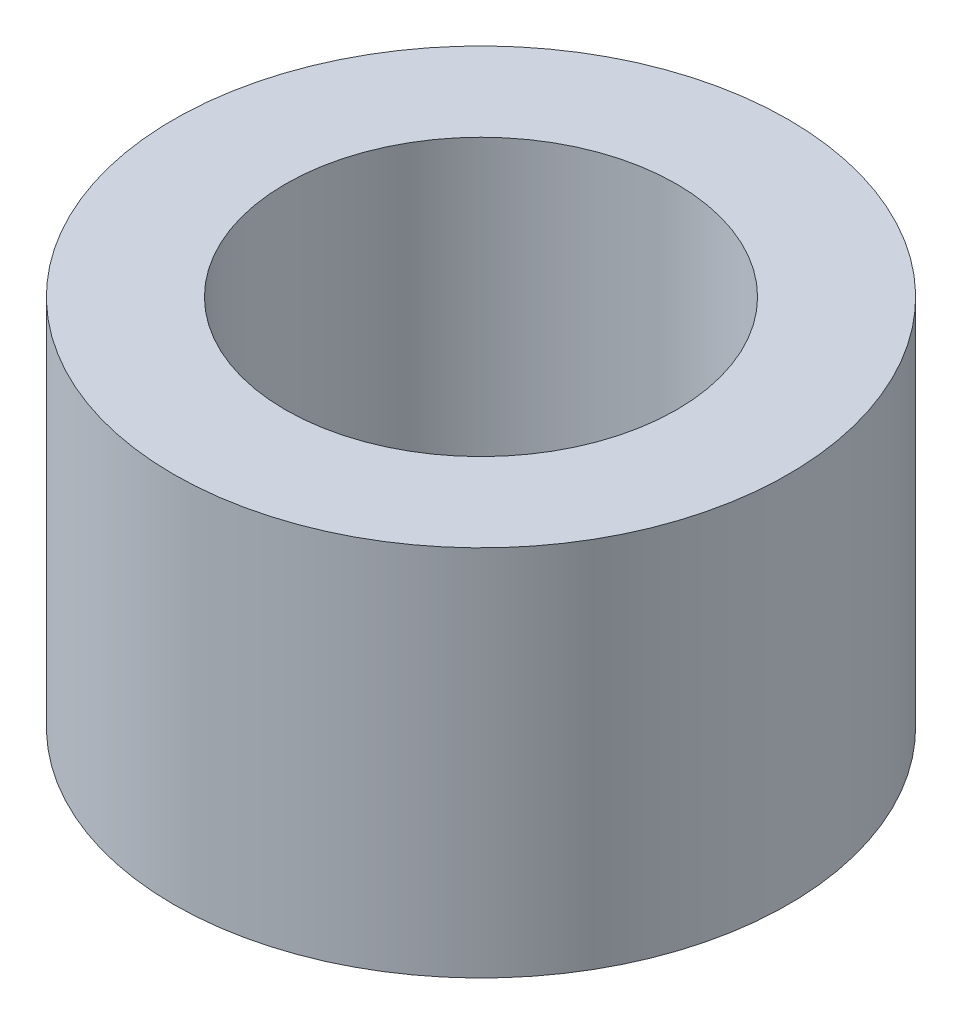
ISO-10303-21;
HEADER;
FILE_DESCRIPTION(('STEP AP214'),'2;1');
FILE_NAME('part.step','',(''),(''),'','','');
FILE_SCHEMA(('AUTOMOTIVE_DESIGN { 1 0 10303 214 1 1 1 1 }'));
ENDSEC;
DATA;
#1=APPLICATION_CONTEXT('core data for automotive mechanical design processes');
#2=APPLICATION_PROTOCOL_DEFINITION('international standard','automotive_design',2000,#1);
#3=PRODUCT_CONTEXT('',#1,'mechanical');
#4=PRODUCT('Part','Part','',(#3));
#5=PRODUCT_RELATED_PRODUCT_CATEGORY('part','',(#4));
#6=PRODUCT_DEFINITION_FORMATION('','',#4);
#7=PRODUCT_DEFINITION_CONTEXT('part definition',#1,'design');
#8=PRODUCT_DEFINITION('design','',#6,#7);
#9=PRODUCT_DEFINITION_SHAPE('','',#8);
#10=(LENGTH_UNIT() NAMED_UNIT(*) SI_UNIT(.MILLI.,.METRE.));
#11=(NAMED_UNIT(*) PLANE_ANGLE_UNIT() SI_UNIT($,.RADIAN.));
#12=(NAMED_UNIT(*) SI_UNIT($,.STERADIAN.) SOLID_ANGLE_UNIT());
#13=UNCERTAINTY_MEASURE_WITH_UNIT(LENGTH_MEASURE(1.E-05),#10,'distance_accuracy_value','');
#14=(GEOMETRIC_REPRESENTATION_CONTEXT(3) GLOBAL_UNCERTAINTY_ASSIGNED_CONTEXT((#13)) GLOBAL_UNIT_ASSIGNED_CONTEXT((#10,
#11,#12)) REPRESENTATION_CONTEXT('',''));
#15=CARTESIAN_POINT('',(0.,0.,0.));
#16=DIRECTION('',(0.,0.,1.));
#17=DIRECTION('',(1.,0.,0.));
#18=AXIS2_PLACEMENT_3D('',#15,#16,#17);
#19=CARTESIAN_POINT('',(0.,40.01,0.));
#20=DIRECTION('',(0.,-1.,0.));
#21=DIRECTION('',(0.,0.,-1.));
#22=AXIS2_PLACEMENT_3D('',#19,#20,#21);
#23=CYLINDRICAL_SURFACE('',#22,21.);
#24=CARTESIAN_POINT('',(0.,40.,0.));
#25=DIRECTION('',(0.,1.,0.));
#26=DIRECTION('',(0.,0.,1.));
#27=AXIS2_PLACEMENT_3D('',#24,#25,#26);
#28=CIRCLE('',#27,21.);
#29=CARTESIAN_POINT('',(0.,40.,21.));
#30=VERTEX_POINT('',#29);
#31=EDGE_CURVE('E10',#30,#30,#28,.T.);
#32=ORIENTED_EDGE('',*,*,#31,.T.);
#33=EDGE_LOOP('',(#32));
#34=FACE_BOUND('',#33,.T.);
#35=CARTESIAN_POINT('',(0.,0.,0.));
#36=DIRECTION('',(0.,1.,0.));
#37=DIRECTION('',(0.,0.,1.));
#38=AXIS2_PLACEMENT_3D('',#35,#36,#37);
#39=CIRCLE('',#38,21.);
#40=CARTESIAN_POINT('',(0.,0.,21.));
#41=VERTEX_POINT('',#40);
#42=EDGE_CURVE('E41',#41,#41,#39,.T.);
#43=ORIENTED_EDGE('',*,*,#42,.F.);
#44=EDGE_LOOP('',(#43));
#45=FACE_BOUND('',#44,.T.);
#46=ADVANCED_FACE('F35',(#34,#45),#23,.F.);
#47=CARTESIAN_POINT('',(0.,40.,0.));
#48=DIRECTION('',(0.,-1.,0.));
#49=DIRECTION('',(0.,0.,-1.));
#50=AXIS2_PLACEMENT_3D('',#47,#48,#49);
#51=CYLINDRICAL_SURFACE('',#50,33.);
#52=CARTESIAN_POINT('',(0.,40.,0.));
#53=DIRECTION('',(0.,1.,0.));
#54=DIRECTION('',(0.,0.,1.));
#55=AXIS2_PLACEMENT_3D('',#52,#53,#54);
#56=CIRCLE('',#55,33.);
#57=CARTESIAN_POINT('',(0.,40.,33.));
#58=VERTEX_POINT('',#57);
#59=EDGE_CURVE('E45',#58,#58,#56,.T.);
#60=ORIENTED_EDGE('',*,*,#59,.F.);
#61=EDGE_LOOP('',(#60));
#62=FACE_BOUND('',#61,.T.);
#63=CARTESIAN_POINT('',(0.,0.,0.));
#64=DIRECTION('',(0.,1.,0.));
#65=DIRECTION('',(0.,0.,1.));
#66=AXIS2_PLACEMENT_3D('',#63,#64,#65);
#67=CIRCLE('',#66,33.);
#68=CARTESIAN_POINT('',(0.,0.,33.));
#69=VERTEX_POINT('',#68);
#70=EDGE_CURVE('E49',#69,#69,#67,.T.);
#71=ORIENTED_EDGE('',*,*,#70,.T.);
#72=EDGE_LOOP('',(#71));
#73=FACE_BOUND('',#72,.T.);
#74=ADVANCED_FACE('F55',(#62,#73),#51,.T.);
#75=CARTESIAN_POINT('',(0.,0.,0.));
#76=DIRECTION('',(0.,1.,0.));
#77=DIRECTION('',(0.,0.,1.));
#78=AXIS2_PLACEMENT_3D('',#75,#76,#77);
#79=PLANE('',#78);
#80=ORIENTED_EDGE('',*,*,#42,.T.);
#81=EDGE_LOOP('',(#80));
#82=FACE_BOUND('',#81,.T.);
#83=ORIENTED_EDGE('',*,*,#70,.F.);
#84=EDGE_LOOP('',(#83));
#85=FACE_BOUND('',#84,.T.);
#86=ADVANCED_FACE('F57',(#82,#85),#79,.F.);
#87=CARTESIAN_POINT('',(0.,40.,0.));
#88=DIRECTION('',(0.,1.,0.));
#89=DIRECTION('',(0.,0.,1.));
#90=AXIS2_PLACEMENT_3D('',#87,#88,#89);
#91=PLANE('',#90);
#92=ORIENTED_EDGE('',*,*,#31,.F.);
#93=EDGE_LOOP('',(#92));
#94=FACE_BOUND('',#93,.T.);
#95=ORIENTED_EDGE('',*,*,#59,.T.);
#96=EDGE_LOOP('',(#95));
#97=FACE_BOUND('',#96,.T.);
#98=ADVANCED_FACE('F59',(#94,#97),#91,.T.);
#99=CLOSED_SHELL('',(#46,#74,#86,#98));
#100=MANIFOLD_SOLID_BREP('B2',#99);
#101=ADVANCED_BREP_SHAPE_REPRESENTATION('',(#18,#100),#14);
#102=SHAPE_DEFINITION_REPRESENTATION(#9,#101);
ENDSEC;
END-ISO-10303-21;
